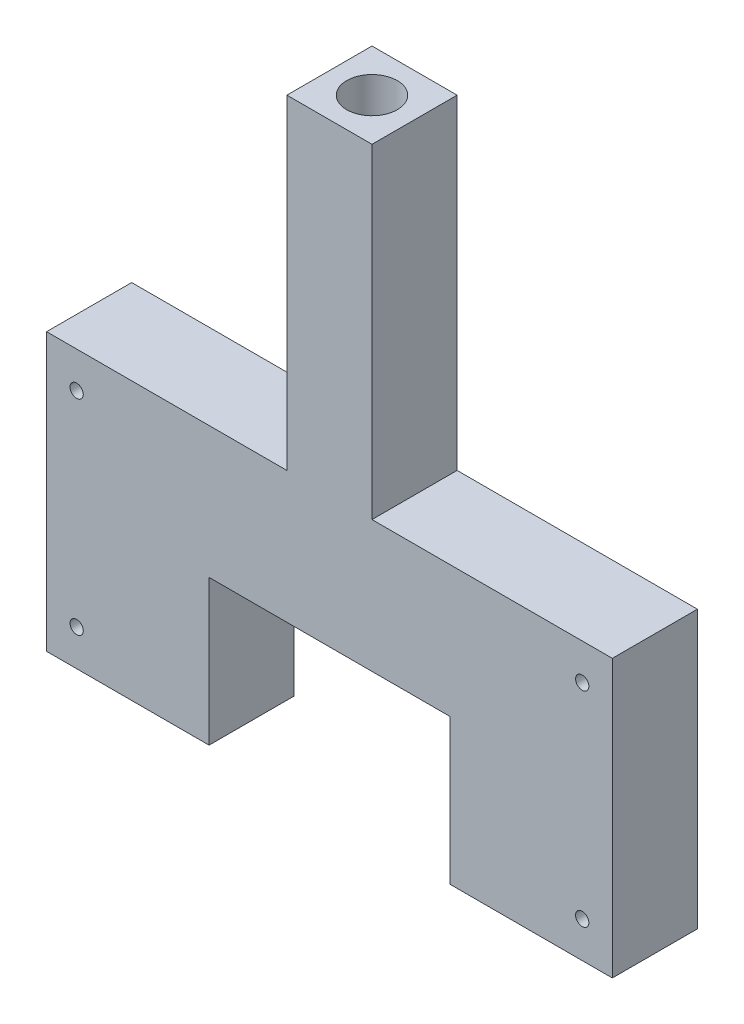
ISO-10303-21;
HEADER;
FILE_DESCRIPTION(('STEP AP214'),'2;1');
FILE_NAME('part.step','',(''),(''),'','','');
FILE_SCHEMA(('AUTOMOTIVE_DESIGN { 1 0 10303 214 1 1 1 1 }'));
ENDSEC;
DATA;
#1=APPLICATION_CONTEXT('core data for automotive mechanical design processes');
#2=APPLICATION_PROTOCOL_DEFINITION('international standard','automotive_design',2000,#1);
#3=PRODUCT_CONTEXT('',#1,'mechanical');
#4=PRODUCT('Part','Part','',(#3));
#5=PRODUCT_RELATED_PRODUCT_CATEGORY('part','',(#4));
#6=PRODUCT_DEFINITION_FORMATION('','',#4);
#7=PRODUCT_DEFINITION_CONTEXT('part definition',#1,'design');
#8=PRODUCT_DEFINITION('design','',#6,#7);
#9=PRODUCT_DEFINITION_SHAPE('','',#8);
#10=(LENGTH_UNIT() NAMED_UNIT(*) SI_UNIT(.MILLI.,.METRE.));
#11=(NAMED_UNIT(*) PLANE_ANGLE_UNIT() SI_UNIT($,.RADIAN.));
#12=(NAMED_UNIT(*) SI_UNIT($,.STERADIAN.) SOLID_ANGLE_UNIT());
#13=UNCERTAINTY_MEASURE_WITH_UNIT(LENGTH_MEASURE(1.E-05),#10,'distance_accuracy_value','');
#14=(GEOMETRIC_REPRESENTATION_CONTEXT(3) GLOBAL_UNCERTAINTY_ASSIGNED_CONTEXT((#13)) GLOBAL_UNIT_ASSIGNED_CONTEXT((#10,
#11,#12)) REPRESENTATION_CONTEXT('',''));
#15=CARTESIAN_POINT('',(0.,0.,0.));
#16=DIRECTION('',(0.,0.,1.));
#17=DIRECTION('',(1.,0.,0.));
#18=AXIS2_PLACEMENT_3D('',#15,#16,#17);
#19=CARTESIAN_POINT('',(-23.5,11.5,7.07106781186547));
#20=DIRECTION('',(0.,-1.,0.));
#21=DIRECTION('',(0.,0.,-1.));
#22=AXIS2_PLACEMENT_3D('',#19,#20,#21);
#23=PLANE('',#22);
#24=DIRECTION('',(0.,0.,-1.));
#25=VECTOR('',#24,1.);
#26=CARTESIAN_POINT('',(3.53553390593273,11.5,0.));
#27=LINE('',#26,#25);
#28=CARTESIAN_POINT('',(3.53553390593274,11.5,7.07106781186547));
#29=VERTEX_POINT('',#28);
#30=CARTESIAN_POINT('',(3.53553390593274,11.5,0.));
#31=VERTEX_POINT('',#30);
#32=EDGE_CURVE('E56',#29,#31,#27,.T.);
#33=ORIENTED_EDGE('',*,*,#32,.F.);
#34=DIRECTION('',(-1.,0.,0.));
#35=VECTOR('',#34,1.);
#36=CARTESIAN_POINT('',(-23.5,11.5,7.07106781186547));
#37=LINE('',#36,#35);
#38=CARTESIAN_POINT('',(23.5,11.5,7.07106781186547));
#39=VERTEX_POINT('',#38);
#40=EDGE_CURVE('E221',#39,#29,#37,.T.);
#41=ORIENTED_EDGE('',*,*,#40,.F.);
#42=DIRECTION('',(0.,0.,-1.));
#43=VECTOR('',#42,1.);
#44=CARTESIAN_POINT('',(23.5,11.5,7.07106781186547));
#45=LINE('',#44,#43);
#46=CARTESIAN_POINT('',(23.5,11.5,0.));
#47=VERTEX_POINT('',#46);
#48=EDGE_CURVE('E49',#39,#47,#45,.T.);
#49=ORIENTED_EDGE('',*,*,#48,.T.);
#50=DIRECTION('',(-1.,0.,0.));
#51=VECTOR('',#50,1.);
#52=CARTESIAN_POINT('',(-23.5,11.5,0.));
#53=LINE('',#52,#51);
#54=EDGE_CURVE('E233',#47,#31,#53,.T.);
#55=ORIENTED_EDGE('',*,*,#54,.T.);
#56=EDGE_LOOP('',(#33,#41,#49,#55));
#57=FACE_BOUND('',#56,.T.);
#58=ADVANCED_FACE('F41',(#57),#23,.F.);
#59=DIRECTION('',(0.,0.,1.));
#60=VECTOR('',#59,1.);
#61=CARTESIAN_POINT('',(-3.53553390593274,11.5,0.));
#62=LINE('',#61,#60);
#63=CARTESIAN_POINT('',(-3.53553390593274,11.5,0.));
#64=VERTEX_POINT('',#63);
#65=CARTESIAN_POINT('',(-3.53553390593274,11.5,7.07106781186548));
#66=VERTEX_POINT('',#65);
#67=EDGE_CURVE('E64',#64,#66,#62,.T.);
#68=ORIENTED_EDGE('',*,*,#67,.F.);
#69=CARTESIAN_POINT('',(-23.5,11.5,0.));
#70=VERTEX_POINT('',#69);
#71=EDGE_CURVE('E232',#64,#70,#53,.T.);
#72=ORIENTED_EDGE('',*,*,#71,.T.);
#73=DIRECTION('',(0.,0.,-1.));
#74=VECTOR('',#73,1.);
#75=CARTESIAN_POINT('',(-23.5,11.5,7.07106781186547));
#76=LINE('',#75,#74);
#77=CARTESIAN_POINT('',(-23.5,11.5,7.07106781186547));
#78=VERTEX_POINT('',#77);
#79=EDGE_CURVE('E245',#78,#70,#76,.T.);
#80=ORIENTED_EDGE('',*,*,#79,.F.);
#81=EDGE_CURVE('E219',#66,#78,#37,.T.);
#82=ORIENTED_EDGE('',*,*,#81,.F.);
#83=EDGE_LOOP('',(#68,#72,#80,#82));
#84=FACE_BOUND('',#83,.T.);
#85=ADVANCED_FACE('F307',(#84),#23,.F.);
#86=CARTESIAN_POINT('',(-23.5,-11.5,7.07106781186547));
#87=DIRECTION('',(0.,1.,0.));
#88=DIRECTION('',(0.,0.,1.));
#89=AXIS2_PLACEMENT_3D('',#86,#87,#88);
#90=PLANE('',#89);
#91=DIRECTION('',(1.,0.,0.));
#92=VECTOR('',#91,1.);
#93=CARTESIAN_POINT('',(-23.5,-11.5,7.07106781186547));
#94=LINE('',#93,#92);
#95=CARTESIAN_POINT('',(10.,-11.5,7.07106781186547));
#96=VERTEX_POINT('',#95);
#97=CARTESIAN_POINT('',(23.5,-11.5,7.07106781186547));
#98=VERTEX_POINT('',#97);
#99=EDGE_CURVE('E225',#96,#98,#94,.T.);
#100=ORIENTED_EDGE('',*,*,#99,.F.);
#101=DIRECTION('',(0.,0.,-1.));
#102=VECTOR('',#101,1.);
#103=CARTESIAN_POINT('',(10.,-11.5,7.07106781186547));
#104=LINE('',#103,#102);
#105=CARTESIAN_POINT('',(10.,-11.5,0.));
#106=VERTEX_POINT('',#105);
#107=EDGE_CURVE('E188',#96,#106,#104,.T.);
#108=ORIENTED_EDGE('',*,*,#107,.T.);
#109=DIRECTION('',(1.,0.,0.));
#110=VECTOR('',#109,1.);
#111=CARTESIAN_POINT('',(-23.5,-11.5,0.));
#112=LINE('',#111,#110);
#113=CARTESIAN_POINT('',(23.5,-11.5,0.));
#114=VERTEX_POINT('',#113);
#115=EDGE_CURVE('E237',#106,#114,#112,.T.);
#116=ORIENTED_EDGE('',*,*,#115,.T.);
#117=DIRECTION('',(0.,0.,-1.));
#118=VECTOR('',#117,1.);
#119=CARTESIAN_POINT('',(23.5,-11.5,7.07106781186547));
#120=LINE('',#119,#118);
#121=EDGE_CURVE('E229',#98,#114,#120,.T.);
#122=ORIENTED_EDGE('',*,*,#121,.F.);
#123=EDGE_LOOP('',(#100,#108,#116,#122));
#124=FACE_BOUND('',#123,.T.);
#125=ADVANCED_FACE('F272',(#124),#90,.F.);
#126=CARTESIAN_POINT('',(23.5,11.5,7.07106781186547));
#127=DIRECTION('',(-1.,0.,0.));
#128=DIRECTION('',(0.,-1.,0.));
#129=AXIS2_PLACEMENT_3D('',#126,#127,#128);
#130=PLANE('',#129);
#131=DIRECTION('',(0.,1.,0.));
#132=VECTOR('',#131,1.);
#133=CARTESIAN_POINT('',(23.5,11.5,0.));
#134=LINE('',#133,#132);
#135=EDGE_CURVE('E215',#114,#47,#134,.T.);
#136=ORIENTED_EDGE('',*,*,#135,.T.);
#137=ORIENTED_EDGE('',*,*,#48,.F.);
#138=DIRECTION('',(0.,1.,0.));
#139=VECTOR('',#138,1.);
#140=CARTESIAN_POINT('',(23.5,11.5,7.07106781186547));
#141=LINE('',#140,#139);
#142=EDGE_CURVE('E216',#98,#39,#141,.T.);
#143=ORIENTED_EDGE('',*,*,#142,.F.);
#144=ORIENTED_EDGE('',*,*,#121,.T.);
#145=EDGE_LOOP('',(#136,#137,#143,#144));
#146=FACE_BOUND('',#145,.T.);
#147=ADVANCED_FACE('F43',(#146),#130,.F.);
#148=CARTESIAN_POINT('',(-23.5,11.5,7.07106781186547));
#149=DIRECTION('',(1.,0.,0.));
#150=DIRECTION('',(0.,1.,0.));
#151=AXIS2_PLACEMENT_3D('',#148,#149,#150);
#152=PLANE('',#151);
#153=DIRECTION('',(0.,-1.,0.));
#154=VECTOR('',#153,1.);
#155=CARTESIAN_POINT('',(-23.5,11.5,0.));
#156=LINE('',#155,#154);
#157=CARTESIAN_POINT('',(-23.5,-11.5,0.));
#158=VERTEX_POINT('',#157);
#159=EDGE_CURVE('E235',#70,#158,#156,.T.);
#160=ORIENTED_EDGE('',*,*,#159,.T.);
#161=DIRECTION('',(0.,0.,-1.));
#162=VECTOR('',#161,1.);
#163=CARTESIAN_POINT('',(-23.5,-11.5,7.07106781186547));
#164=LINE('',#163,#162);
#165=CARTESIAN_POINT('',(-23.5,-11.5,7.07106781186547));
#166=VERTEX_POINT('',#165);
#167=EDGE_CURVE('E242',#166,#158,#164,.T.);
#168=ORIENTED_EDGE('',*,*,#167,.F.);
#169=DIRECTION('',(0.,-1.,0.));
#170=VECTOR('',#169,1.);
#171=CARTESIAN_POINT('',(-23.5,11.5,7.07106781186547));
#172=LINE('',#171,#170);
#173=EDGE_CURVE('E223',#78,#166,#172,.T.);
#174=ORIENTED_EDGE('',*,*,#173,.F.);
#175=ORIENTED_EDGE('',*,*,#79,.T.);
#176=EDGE_LOOP('',(#160,#168,#174,#175));
#177=FACE_BOUND('',#176,.T.);
#178=ADVANCED_FACE('F291',(#177),#152,.F.);
#179=CARTESIAN_POINT('',(-9.99999999999999,-11.5,0.));
#180=VERTEX_POINT('',#179);
#181=EDGE_CURVE('E220',#158,#180,#112,.T.);
#182=ORIENTED_EDGE('',*,*,#181,.T.);
#183=DIRECTION('',(0.,0.,1.));
#184=VECTOR('',#183,1.);
#185=CARTESIAN_POINT('',(-9.99999999999999,-11.5,7.07106781186547));
#186=LINE('',#185,#184);
#187=CARTESIAN_POINT('',(-9.99999999999999,-11.5,7.07106781186547));
#188=VERTEX_POINT('',#187);
#189=EDGE_CURVE('E185',#180,#188,#186,.T.);
#190=ORIENTED_EDGE('',*,*,#189,.T.);
#191=EDGE_CURVE('E226',#166,#188,#94,.T.);
#192=ORIENTED_EDGE('',*,*,#191,.F.);
#193=ORIENTED_EDGE('',*,*,#167,.T.);
#194=EDGE_LOOP('',(#182,#190,#192,#193));
#195=FACE_BOUND('',#194,.T.);
#196=ADVANCED_FACE('F286',(#195),#90,.F.);
#197=CARTESIAN_POINT('',(0.,0.,7.07106781186547));
#198=DIRECTION('',(0.,0.,1.));
#199=DIRECTION('',(1.,0.,0.));
#200=AXIS2_PLACEMENT_3D('',#197,#198,#199);
#201=PLANE('',#200);
#202=ORIENTED_EDGE('',*,*,#40,.T.);
#203=DIRECTION('',(0.,-1.,0.));
#204=VECTOR('',#203,1.);
#205=CARTESIAN_POINT('',(3.53553390593274,38.5,7.07106781186548));
#206=LINE('',#205,#204);
#207=CARTESIAN_POINT('',(3.53553390593274,38.5,7.07106781186548));
#208=VERTEX_POINT('',#207);
#209=EDGE_CURVE('E155',#208,#29,#206,.T.);
#210=ORIENTED_EDGE('',*,*,#209,.F.);
#211=DIRECTION('',(1.,0.,0.));
#212=VECTOR('',#211,1.);
#213=CARTESIAN_POINT('',(-3.53553390593274,38.5,7.07106781186548));
#214=LINE('',#213,#212);
#215=CARTESIAN_POINT('',(-3.53553390593274,38.5,7.07106781186548));
#216=VERTEX_POINT('',#215);
#217=EDGE_CURVE('E154',#216,#208,#214,.T.);
#218=ORIENTED_EDGE('',*,*,#217,.F.);
#219=DIRECTION('',(0.,-1.,0.));
#220=VECTOR('',#219,1.);
#221=CARTESIAN_POINT('',(-3.53553390593274,38.5,7.07106781186548));
#222=LINE('',#221,#220);
#223=EDGE_CURVE('E160',#216,#66,#222,.T.);
#224=ORIENTED_EDGE('',*,*,#223,.T.);
#225=ORIENTED_EDGE('',*,*,#81,.T.);
#226=ORIENTED_EDGE('',*,*,#173,.T.);
#227=ORIENTED_EDGE('',*,*,#191,.T.);
#228=DIRECTION('',(0.,-1.,0.));
#229=VECTOR('',#228,1.);
#230=CARTESIAN_POINT('',(-10.,0.5725800859553,7.07106781186547));
#231=LINE('',#230,#229);
#232=CARTESIAN_POINT('',(-10.,0.5725800859553,7.07106781186547));
#233=VERTEX_POINT('',#232);
#234=EDGE_CURVE('E178',#233,#188,#231,.T.);
#235=ORIENTED_EDGE('',*,*,#234,.F.);
#236=DIRECTION('',(-1.,0.,0.));
#237=VECTOR('',#236,1.);
#238=CARTESIAN_POINT('',(-10.,0.5725800859553,7.07106781186547));
#239=LINE('',#238,#237);
#240=CARTESIAN_POINT('',(10.,0.5725800859553,7.07106781186547));
#241=VERTEX_POINT('',#240);
#242=EDGE_CURVE('E175',#241,#233,#239,.T.);
#243=ORIENTED_EDGE('',*,*,#242,.F.);
#244=DIRECTION('',(0.,1.,0.));
#245=VECTOR('',#244,1.);
#246=CARTESIAN_POINT('',(10.,0.5725800859553,7.07106781186547));
#247=LINE('',#246,#245);
#248=EDGE_CURVE('E169',#96,#241,#247,.T.);
#249=ORIENTED_EDGE('',*,*,#248,.F.);
#250=ORIENTED_EDGE('',*,*,#99,.T.);
#251=ORIENTED_EDGE('',*,*,#142,.T.);
#252=EDGE_LOOP('',(#202,#210,#218,#224,#225,#226,#227,#235,#243,#249,#250,#251));
#253=FACE_BOUND('',#252,.T.);
#254=CARTESIAN_POINT('',(21.,-8.5,7.07106781186548));
#255=DIRECTION('',(0.,0.,1.));
#256=DIRECTION('',(1.,0.,0.));
#257=AXIS2_PLACEMENT_3D('',#254,#255,#256);
#258=CIRCLE('',#257,0.549999999999988);
#259=CARTESIAN_POINT('',(21.55,-8.5,7.07106781186548));
#260=VERTEX_POINT('',#259);
#261=EDGE_CURVE('E203',#260,#260,#258,.T.);
#262=ORIENTED_EDGE('',*,*,#261,.F.);
#263=EDGE_LOOP('',(#262));
#264=FACE_BOUND('',#263,.T.);
#265=CARTESIAN_POINT('',(21.,8.5,7.07106781186548));
#266=DIRECTION('',(0.,0.,1.));
#267=DIRECTION('',(1.,0.,0.));
#268=AXIS2_PLACEMENT_3D('',#265,#266,#267);
#269=CIRCLE('',#268,0.549999999999988);
#270=CARTESIAN_POINT('',(21.55,8.5,7.07106781186548));
#271=VERTEX_POINT('',#270);
#272=EDGE_CURVE('E209',#271,#271,#269,.T.);
#273=ORIENTED_EDGE('',*,*,#272,.F.);
#274=EDGE_LOOP('',(#273));
#275=FACE_BOUND('',#274,.T.);
#276=CARTESIAN_POINT('',(-21.,-8.5,7.07106781186548));
#277=DIRECTION('',(0.,0.,1.));
#278=DIRECTION('',(1.,0.,0.));
#279=AXIS2_PLACEMENT_3D('',#276,#277,#278);
#280=CIRCLE('',#279,0.549999999999988);
#281=CARTESIAN_POINT('',(-20.45,-8.5,7.07106781186548));
#282=VERTEX_POINT('',#281);
#283=EDGE_CURVE('E197',#282,#282,#280,.T.);
#284=ORIENTED_EDGE('',*,*,#283,.F.);
#285=EDGE_LOOP('',(#284));
#286=FACE_BOUND('',#285,.T.);
#287=CARTESIAN_POINT('',(-21.,8.5,7.07106781186548));
#288=DIRECTION('',(0.,0.,1.));
#289=DIRECTION('',(1.,0.,0.));
#290=AXIS2_PLACEMENT_3D('',#287,#288,#289);
#291=CIRCLE('',#290,0.549999999999988);
#292=CARTESIAN_POINT('',(-20.45,8.5,7.07106781186548));
#293=VERTEX_POINT('',#292);
#294=EDGE_CURVE('E191',#293,#293,#291,.T.);
#295=ORIENTED_EDGE('',*,*,#294,.F.);
#296=EDGE_LOOP('',(#295));
#297=FACE_BOUND('',#296,.T.);
#298=ADVANCED_FACE('F266',(#253,#264,#275,#286,#297),#201,.T.);
#299=CARTESIAN_POINT('',(0.,0.,0.));
#300=DIRECTION('',(0.,0.,1.));
#301=DIRECTION('',(1.,0.,0.));
#302=AXIS2_PLACEMENT_3D('',#299,#300,#301);
#303=PLANE('',#302);
#304=DIRECTION('',(0.,-1.,0.));
#305=VECTOR('',#304,1.);
#306=CARTESIAN_POINT('',(10.,0.5725800859553,0.));
#307=LINE('',#306,#305);
#308=CARTESIAN_POINT('',(10.,0.5725800859553,0.));
#309=VERTEX_POINT('',#308);
#310=EDGE_CURVE('E170',#309,#106,#307,.T.);
#311=ORIENTED_EDGE('',*,*,#310,.F.);
#312=DIRECTION('',(1.,0.,0.));
#313=VECTOR('',#312,1.);
#314=CARTESIAN_POINT('',(-10.,0.5725800859553,0.));
#315=LINE('',#314,#313);
#316=CARTESIAN_POINT('',(-10.,0.5725800859553,0.));
#317=VERTEX_POINT('',#316);
#318=EDGE_CURVE('E172',#317,#309,#315,.T.);
#319=ORIENTED_EDGE('',*,*,#318,.F.);
#320=DIRECTION('',(0.,-1.,0.));
#321=VECTOR('',#320,1.);
#322=CARTESIAN_POINT('',(-10.,0.,0.));
#323=LINE('',#322,#321);
#324=EDGE_CURVE('E11',#317,#180,#323,.T.);
#325=ORIENTED_EDGE('',*,*,#324,.T.);
#326=ORIENTED_EDGE('',*,*,#181,.F.);
#327=ORIENTED_EDGE('',*,*,#159,.F.);
#328=ORIENTED_EDGE('',*,*,#71,.F.);
#329=DIRECTION('',(0.,-1.,0.));
#330=VECTOR('',#329,1.);
#331=CARTESIAN_POINT('',(-3.53553390593274,38.5,0.));
#332=LINE('',#331,#330);
#333=CARTESIAN_POINT('',(-3.53553390593274,38.5,0.));
#334=VERTEX_POINT('',#333);
#335=EDGE_CURVE('E163',#334,#64,#332,.T.);
#336=ORIENTED_EDGE('',*,*,#335,.F.);
#337=DIRECTION('',(-1.,0.,0.));
#338=VECTOR('',#337,1.);
#339=CARTESIAN_POINT('',(-3.53553390593274,38.5,0.));
#340=LINE('',#339,#338);
#341=CARTESIAN_POINT('',(3.53553390593273,38.5,0.));
#342=VERTEX_POINT('',#341);
#343=EDGE_CURVE('E150',#342,#334,#340,.T.);
#344=ORIENTED_EDGE('',*,*,#343,.F.);
#345=DIRECTION('',(0.,-1.,0.));
#346=VECTOR('',#345,1.);
#347=CARTESIAN_POINT('',(3.53553390593273,38.5,0.));
#348=LINE('',#347,#346);
#349=EDGE_CURVE('E166',#342,#31,#348,.T.);
#350=ORIENTED_EDGE('',*,*,#349,.T.);
#351=ORIENTED_EDGE('',*,*,#54,.F.);
#352=ORIENTED_EDGE('',*,*,#135,.F.);
#353=ORIENTED_EDGE('',*,*,#115,.F.);
#354=EDGE_LOOP('',(#311,#319,#325,#326,#327,#328,#336,#344,#350,#351,#352,#353));
#355=FACE_BOUND('',#354,.T.);
#356=CARTESIAN_POINT('',(21.,-8.5,0.));
#357=DIRECTION('',(0.,0.,1.));
#358=DIRECTION('',(1.,0.,0.));
#359=AXIS2_PLACEMENT_3D('',#356,#357,#358);
#360=CIRCLE('',#359,0.549999999999998);
#361=CARTESIAN_POINT('',(21.55,-8.5,0.));
#362=VERTEX_POINT('',#361);
#363=EDGE_CURVE('E206',#362,#362,#360,.T.);
#364=ORIENTED_EDGE('',*,*,#363,.T.);
#365=EDGE_LOOP('',(#364));
#366=FACE_BOUND('',#365,.T.);
#367=CARTESIAN_POINT('',(21.,8.5,0.));
#368=DIRECTION('',(0.,0.,1.));
#369=DIRECTION('',(1.,0.,0.));
#370=AXIS2_PLACEMENT_3D('',#367,#368,#369);
#371=CIRCLE('',#370,0.549999999999998);
#372=CARTESIAN_POINT('',(21.55,8.5,0.));
#373=VERTEX_POINT('',#372);
#374=EDGE_CURVE('E212',#373,#373,#371,.T.);
#375=ORIENTED_EDGE('',*,*,#374,.T.);
#376=EDGE_LOOP('',(#375));
#377=FACE_BOUND('',#376,.T.);
#378=CARTESIAN_POINT('',(-21.,-8.5,0.));
#379=DIRECTION('',(0.,0.,1.));
#380=DIRECTION('',(1.,0.,0.));
#381=AXIS2_PLACEMENT_3D('',#378,#379,#380);
#382=CIRCLE('',#381,0.549999999999998);
#383=CARTESIAN_POINT('',(-20.45,-8.5,0.));
#384=VERTEX_POINT('',#383);
#385=EDGE_CURVE('E200',#384,#384,#382,.T.);
#386=ORIENTED_EDGE('',*,*,#385,.T.);
#387=EDGE_LOOP('',(#386));
#388=FACE_BOUND('',#387,.T.);
#389=CARTESIAN_POINT('',(-21.,8.5,0.));
#390=DIRECTION('',(0.,0.,1.));
#391=DIRECTION('',(1.,0.,0.));
#392=AXIS2_PLACEMENT_3D('',#389,#390,#391);
#393=CIRCLE('',#392,0.549999999999998);
#394=CARTESIAN_POINT('',(-20.45,8.5,0.));
#395=VERTEX_POINT('',#394);
#396=EDGE_CURVE('E194',#395,#395,#393,.T.);
#397=ORIENTED_EDGE('',*,*,#396,.T.);
#398=EDGE_LOOP('',(#397));
#399=FACE_BOUND('',#398,.T.);
#400=ADVANCED_FACE('F256',(#355,#366,#377,#388,#399),#303,.F.);
#401=CARTESIAN_POINT('',(21.,8.5,7.07106781186547));
#402=DIRECTION('',(0.,0.,1.));
#403=DIRECTION('',(1.,0.,0.));
#404=AXIS2_PLACEMENT_3D('',#401,#402,#403);
#405=CYLINDRICAL_SURFACE('',#404,0.549999999999993);
#406=ORIENTED_EDGE('',*,*,#374,.F.);
#407=EDGE_LOOP('',(#406));
#408=FACE_BOUND('',#407,.T.);
#409=ORIENTED_EDGE('',*,*,#272,.T.);
#410=EDGE_LOOP('',(#409));
#411=FACE_BOUND('',#410,.T.);
#412=ADVANCED_FACE('F318',(#408,#411),#405,.F.);
#413=CARTESIAN_POINT('',(21.,-8.5,7.07106781186547));
#414=DIRECTION('',(0.,0.,1.));
#415=DIRECTION('',(1.,0.,0.));
#416=AXIS2_PLACEMENT_3D('',#413,#414,#415);
#417=CYLINDRICAL_SURFACE('',#416,0.549999999999993);
#418=ORIENTED_EDGE('',*,*,#363,.F.);
#419=EDGE_LOOP('',(#418));
#420=FACE_BOUND('',#419,.T.);
#421=ORIENTED_EDGE('',*,*,#261,.T.);
#422=EDGE_LOOP('',(#421));
#423=FACE_BOUND('',#422,.T.);
#424=ADVANCED_FACE('F323',(#420,#423),#417,.F.);
#425=CARTESIAN_POINT('',(-21.,-8.5,7.07106781186547));
#426=DIRECTION('',(0.,0.,1.));
#427=DIRECTION('',(1.,0.,0.));
#428=AXIS2_PLACEMENT_3D('',#425,#426,#427);
#429=CYLINDRICAL_SURFACE('',#428,0.549999999999993);
#430=ORIENTED_EDGE('',*,*,#385,.F.);
#431=EDGE_LOOP('',(#430));
#432=FACE_BOUND('',#431,.T.);
#433=ORIENTED_EDGE('',*,*,#283,.T.);
#434=EDGE_LOOP('',(#433));
#435=FACE_BOUND('',#434,.T.);
#436=ADVANCED_FACE('F327',(#432,#435),#429,.F.);
#437=CARTESIAN_POINT('',(-21.,8.5,7.07106781186547));
#438=DIRECTION('',(0.,0.,1.));
#439=DIRECTION('',(1.,0.,0.));
#440=AXIS2_PLACEMENT_3D('',#437,#438,#439);
#441=CYLINDRICAL_SURFACE('',#440,0.549999999999993);
#442=ORIENTED_EDGE('',*,*,#396,.F.);
#443=EDGE_LOOP('',(#442));
#444=FACE_BOUND('',#443,.T.);
#445=ORIENTED_EDGE('',*,*,#294,.T.);
#446=EDGE_LOOP('',(#445));
#447=FACE_BOUND('',#446,.T.);
#448=ADVANCED_FACE('F331',(#444,#447),#441,.F.);
#449=CARTESIAN_POINT('',(10.,0.5725800859553,-25.));
#450=DIRECTION('',(1.,0.,0.));
#451=DIRECTION('',(0.,1.,0.));
#452=AXIS2_PLACEMENT_3D('',#449,#450,#451);
#453=PLANE('',#452);
#454=ORIENTED_EDGE('',*,*,#248,.T.);
#455=DIRECTION('',(0.,0.,1.));
#456=VECTOR('',#455,1.);
#457=CARTESIAN_POINT('',(10.,0.5725800859553,-25.));
#458=LINE('',#457,#456);
#459=EDGE_CURVE('E180',#309,#241,#458,.T.);
#460=ORIENTED_EDGE('',*,*,#459,.F.);
#461=ORIENTED_EDGE('',*,*,#310,.T.);
#462=ORIENTED_EDGE('',*,*,#107,.F.);
#463=EDGE_LOOP('',(#454,#460,#461,#462));
#464=FACE_BOUND('',#463,.T.);
#465=ADVANCED_FACE('F274',(#464),#453,.F.);
#466=CARTESIAN_POINT('',(-10.,0.5725800859553,-25.));
#467=DIRECTION('',(-1.,0.,0.));
#468=DIRECTION('',(0.,-1.,0.));
#469=AXIS2_PLACEMENT_3D('',#466,#467,#468);
#470=PLANE('',#469);
#471=ORIENTED_EDGE('',*,*,#324,.F.);
#472=DIRECTION('',(0.,0.,1.));
#473=VECTOR('',#472,1.);
#474=CARTESIAN_POINT('',(-10.,0.5725800859553,-25.));
#475=LINE('',#474,#473);
#476=EDGE_CURVE('E173',#317,#233,#475,.T.);
#477=ORIENTED_EDGE('',*,*,#476,.T.);
#478=ORIENTED_EDGE('',*,*,#234,.T.);
#479=ORIENTED_EDGE('',*,*,#189,.F.);
#480=EDGE_LOOP('',(#471,#477,#478,#479));
#481=FACE_BOUND('',#480,.T.);
#482=ADVANCED_FACE('F283',(#481),#470,.F.);
#483=CARTESIAN_POINT('',(-10.,0.5725800859553,-25.));
#484=DIRECTION('',(0.,1.,0.));
#485=DIRECTION('',(0.,0.,1.));
#486=AXIS2_PLACEMENT_3D('',#483,#484,#485);
#487=PLANE('',#486);
#488=ORIENTED_EDGE('',*,*,#318,.T.);
#489=ORIENTED_EDGE('',*,*,#459,.T.);
#490=ORIENTED_EDGE('',*,*,#242,.T.);
#491=ORIENTED_EDGE('',*,*,#476,.F.);
#492=EDGE_LOOP('',(#488,#489,#490,#491));
#493=FACE_BOUND('',#492,.T.);
#494=ADVANCED_FACE('F280',(#493),#487,.F.);
#495=CARTESIAN_POINT('',(3.53553390593273,38.5,0.));
#496=DIRECTION('',(-1.,0.,0.));
#497=DIRECTION('',(0.,0.,1.));
#498=AXIS2_PLACEMENT_3D('',#495,#496,#497);
#499=PLANE('',#498);
#500=ORIENTED_EDGE('',*,*,#32,.T.);
#501=ORIENTED_EDGE('',*,*,#349,.F.);
#502=DIRECTION('',(0.,0.,-1.));
#503=VECTOR('',#502,1.);
#504=CARTESIAN_POINT('',(3.53553390593273,38.5,0.));
#505=LINE('',#504,#503);
#506=EDGE_CURVE('E147',#208,#342,#505,.T.);
#507=ORIENTED_EDGE('',*,*,#506,.F.);
#508=ORIENTED_EDGE('',*,*,#209,.T.);
#509=EDGE_LOOP('',(#500,#501,#507,#508));
#510=FACE_BOUND('',#509,.T.);
#511=ADVANCED_FACE('F262',(#510),#499,.F.);
#512=CARTESIAN_POINT('',(-3.53553390593274,38.5,0.));
#513=DIRECTION('',(1.,0.,0.));
#514=DIRECTION('',(0.,0.,-1.));
#515=AXIS2_PLACEMENT_3D('',#512,#513,#514);
#516=PLANE('',#515);
#517=ORIENTED_EDGE('',*,*,#67,.T.);
#518=ORIENTED_EDGE('',*,*,#223,.F.);
#519=DIRECTION('',(0.,0.,1.));
#520=VECTOR('',#519,1.);
#521=CARTESIAN_POINT('',(-3.53553390593274,38.5,0.));
#522=LINE('',#521,#520);
#523=EDGE_CURVE('E152',#334,#216,#522,.T.);
#524=ORIENTED_EDGE('',*,*,#523,.F.);
#525=ORIENTED_EDGE('',*,*,#335,.T.);
#526=EDGE_LOOP('',(#517,#518,#524,#525));
#527=FACE_BOUND('',#526,.T.);
#528=ADVANCED_FACE('F295',(#527),#516,.F.);
#529=CARTESIAN_POINT('',(0.,38.5,0.));
#530=DIRECTION('',(0.,1.,0.));
#531=DIRECTION('',(0.,0.,1.));
#532=AXIS2_PLACEMENT_3D('',#529,#530,#531);
#533=PLANE('',#532);
#534=CARTESIAN_POINT('',(0.,38.5,3.53553390593274));
#535=DIRECTION('',(0.,1.,0.));
#536=DIRECTION('',(0.,0.,1.));
#537=AXIS2_PLACEMENT_3D('',#534,#535,#536);
#538=CIRCLE('',#537,2.09999999999999);
#539=CARTESIAN_POINT('',(0.,38.5,5.63553390593273));
#540=VERTEX_POINT('',#539);
#541=EDGE_CURVE('E141',#540,#540,#538,.T.);
#542=ORIENTED_EDGE('',*,*,#541,.F.);
#543=EDGE_LOOP('',(#542));
#544=FACE_BOUND('',#543,.T.);
#545=ORIENTED_EDGE('',*,*,#506,.T.);
#546=ORIENTED_EDGE('',*,*,#343,.T.);
#547=ORIENTED_EDGE('',*,*,#523,.T.);
#548=ORIENTED_EDGE('',*,*,#217,.T.);
#549=EDGE_LOOP('',(#545,#546,#547,#548));
#550=FACE_BOUND('',#549,.T.);
#551=ADVANCED_FACE('F135',(#544,#550),#533,.T.);
#552=CARTESIAN_POINT('',(0.,23.5,3.53553390593274));
#553=DIRECTION('',(0.,1.,0.));
#554=DIRECTION('',(0.,0.,1.));
#555=AXIS2_PLACEMENT_3D('',#552,#553,#554);
#556=CONICAL_SURFACE('',#555,2.09999999999999,1.02974425867665);
#557=CARTESIAN_POINT('',(0.,22.2381927000421,3.53553390593274));
#558=VERTEX_POINT('',#557);
#559=VERTEX_LOOP('',#558);
#560=FACE_BOUND('',#559,.T.);
#561=CARTESIAN_POINT('',(0.,23.5,3.53553390593274));
#562=DIRECTION('',(0.,1.,0.));
#563=DIRECTION('',(0.,0.,1.));
#564=AXIS2_PLACEMENT_3D('',#561,#562,#563);
#565=CIRCLE('',#564,2.09999999999999);
#566=CARTESIAN_POINT('',(0.,23.5,5.63553390593273));
#567=VERTEX_POINT('',#566);
#568=EDGE_CURVE('E139',#567,#567,#565,.T.);
#569=ORIENTED_EDGE('',*,*,#568,.T.);
#570=EDGE_LOOP('',(#569));
#571=FACE_BOUND('',#570,.T.);
#572=ADVANCED_FACE('F131',(#560,#571),#556,.F.);
#573=CARTESIAN_POINT('',(0.,38.5,3.53553390593274));
#574=DIRECTION('',(0.,1.,0.));
#575=DIRECTION('',(0.,0.,1.));
#576=AXIS2_PLACEMENT_3D('',#573,#574,#575);
#577=CYLINDRICAL_SURFACE('',#576,2.09999999999999);
#578=ORIENTED_EDGE('',*,*,#568,.F.);
#579=EDGE_LOOP('',(#578));
#580=FACE_BOUND('',#579,.T.);
#581=ORIENTED_EDGE('',*,*,#541,.T.);
#582=EDGE_LOOP('',(#581));
#583=FACE_BOUND('',#582,.T.);
#584=ADVANCED_FACE('F134',(#580,#583),#577,.F.);
#585=CLOSED_SHELL('',(#58,#85,#125,#147,#178,#196,#298,#400,#412,#424,#436,#448,#465,#482,#494,
#511,#528,#551,#572,#584));
#586=MANIFOLD_SOLID_BREP('B2',#585);
#587=ADVANCED_BREP_SHAPE_REPRESENTATION('',(#18,#586),#14);
#588=SHAPE_DEFINITION_REPRESENTATION(#9,#587);
ENDSEC;
END-ISO-10303-21;
